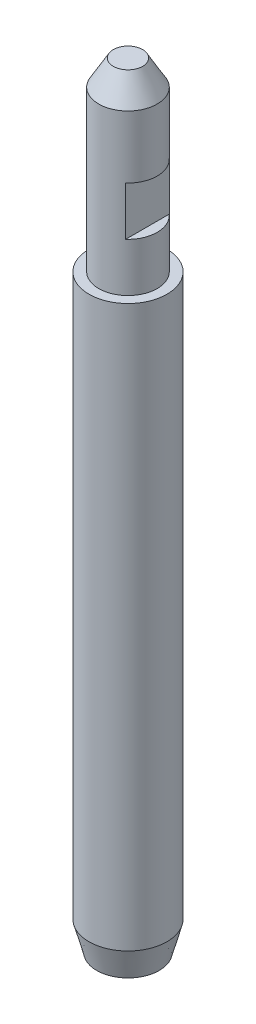
ISO-10303-21;
HEADER;
FILE_DESCRIPTION(('STEP AP214'),'2;1');
FILE_NAME('part.step','',(''),(''),'','','');
FILE_SCHEMA(('AUTOMOTIVE_DESIGN { 1 0 10303 214 1 1 1 1 }'));
ENDSEC;
DATA;
#1=APPLICATION_CONTEXT('core data for automotive mechanical design processes');
#2=APPLICATION_PROTOCOL_DEFINITION('international standard','automotive_design',2000,#1);
#3=PRODUCT_CONTEXT('',#1,'mechanical');
#4=PRODUCT('Part','Part','',(#3));
#5=PRODUCT_RELATED_PRODUCT_CATEGORY('part','',(#4));
#6=PRODUCT_DEFINITION_FORMATION('','',#4);
#7=PRODUCT_DEFINITION_CONTEXT('part definition',#1,'design');
#8=PRODUCT_DEFINITION('design','',#6,#7);
#9=PRODUCT_DEFINITION_SHAPE('','',#8);
#10=(LENGTH_UNIT() NAMED_UNIT(*) SI_UNIT(.MILLI.,.METRE.));
#11=(NAMED_UNIT(*) PLANE_ANGLE_UNIT() SI_UNIT($,.RADIAN.));
#12=(NAMED_UNIT(*) SI_UNIT($,.STERADIAN.) SOLID_ANGLE_UNIT());
#13=UNCERTAINTY_MEASURE_WITH_UNIT(LENGTH_MEASURE(1.E-05),#10,'distance_accuracy_value','');
#14=(GEOMETRIC_REPRESENTATION_CONTEXT(3) GLOBAL_UNCERTAINTY_ASSIGNED_CONTEXT((#13)) GLOBAL_UNIT_ASSIGNED_CONTEXT((#10,
#11,#12)) REPRESENTATION_CONTEXT('',''));
#15=CARTESIAN_POINT('',(0.,0.,0.));
#16=DIRECTION('',(0.,0.,1.));
#17=DIRECTION('',(1.,0.,0.));
#18=AXIS2_PLACEMENT_3D('',#15,#16,#17);
#19=CARTESIAN_POINT('',(-101.000000000001,30.,0.));
#20=DIRECTION('',(0.,-1.,0.));
#21=DIRECTION('',(0.,0.,-1.));
#22=AXIS2_PLACEMENT_3D('',#19,#20,#21);
#23=PLANE('',#22);
#24=CARTESIAN_POINT('',(-101.000000000001,30.,0.));
#25=DIRECTION('',(0.,-1.,0.));
#26=DIRECTION('',(0.,0.,-1.));
#27=AXIS2_PLACEMENT_3D('',#24,#25,#26);
#28=CIRCLE('',#27,1.60000000000001);
#29=CARTESIAN_POINT('',(-101.000000000001,30.,-1.59999999999998));
#30=VERTEX_POINT('',#29);
#31=EDGE_CURVE('E116',#30,#30,#28,.T.);
#32=ORIENTED_EDGE('',*,*,#31,.F.);
#33=EDGE_LOOP('',(#32));
#34=FACE_BOUND('',#33,.T.);
#35=CARTESIAN_POINT('',(-101.000000000001,30.,0.));
#36=DIRECTION('',(0.,1.,0.));
#37=DIRECTION('',(0.,0.,1.));
#38=AXIS2_PLACEMENT_3D('',#35,#36,#37);
#39=CIRCLE('',#38,3.20809032306486);
#40=CARTESIAN_POINT('',(-101.000000000001,30.,3.20809032306489));
#41=VERTEX_POINT('',#40);
#42=EDGE_CURVE('E95',#41,#41,#39,.T.);
#43=ORIENTED_EDGE('',*,*,#42,.F.);
#44=EDGE_LOOP('',(#43));
#45=FACE_BOUND('',#44,.T.);
#46=ADVANCED_FACE('F32',(#34,#45),#23,.T.);
#47=CARTESIAN_POINT('',(-101.000000000001,32.9554471493273,0.));
#48=DIRECTION('',(0.,1.,0.));
#49=DIRECTION('',(0.,0.,1.));
#50=AXIS2_PLACEMENT_3D('',#47,#48,#49);
#51=CONICAL_SURFACE('',#50,3.99999999999999,0.26179938779915);
#52=ORIENTED_EDGE('',*,*,#42,.T.);
#53=EDGE_LOOP('',(#52));
#54=FACE_BOUND('',#53,.T.);
#55=CARTESIAN_POINT('',(-101.000000000001,32.9554471493273,0.));
#56=DIRECTION('',(0.,1.,0.));
#57=DIRECTION('',(0.,0.,1.));
#58=AXIS2_PLACEMENT_3D('',#55,#56,#57);
#59=CIRCLE('',#58,3.99999999999999);
#60=CARTESIAN_POINT('',(-101.000000000001,32.9554471493273,4.00000000000007));
#61=VERTEX_POINT('',#60);
#62=EDGE_CURVE('E98',#61,#61,#59,.T.);
#63=ORIENTED_EDGE('',*,*,#62,.F.);
#64=EDGE_LOOP('',(#63));
#65=FACE_BOUND('',#64,.T.);
#66=ADVANCED_FACE('F136',(#54,#65),#51,.T.);
#67=CARTESIAN_POINT('',(-101.000000000001,106.972874386245,0.));
#68=DIRECTION('',(0.,1.,0.));
#69=DIRECTION('',(0.,0.,1.));
#70=AXIS2_PLACEMENT_3D('',#67,#68,#69);
#71=CYLINDRICAL_SURFACE('',#70,3.99999999999999);
#72=ORIENTED_EDGE('',*,*,#62,.T.);
#73=EDGE_LOOP('',(#72));
#74=FACE_BOUND('',#73,.T.);
#75=CARTESIAN_POINT('',(-101.000000000001,90.5,0.));
#76=DIRECTION('',(0.,1.,0.));
#77=DIRECTION('',(0.,0.,1.));
#78=AXIS2_PLACEMENT_3D('',#75,#76,#77);
#79=CIRCLE('',#78,3.99999999999999);
#80=CARTESIAN_POINT('',(-101.000000000001,90.5,4.00000000000005));
#81=VERTEX_POINT('',#80);
#82=EDGE_CURVE('E101',#81,#81,#79,.T.);
#83=ORIENTED_EDGE('',*,*,#82,.F.);
#84=EDGE_LOOP('',(#83));
#85=FACE_BOUND('',#84,.T.);
#86=ADVANCED_FACE('F141',(#74,#85),#71,.T.);
#87=CARTESIAN_POINT('',(-104.000000000001,90.5,0.));
#88=DIRECTION('',(0.,1.,0.));
#89=DIRECTION('',(0.,0.,1.));
#90=AXIS2_PLACEMENT_3D('',#87,#88,#89);
#91=PLANE('',#90);
#92=ORIENTED_EDGE('',*,*,#82,.T.);
#93=EDGE_LOOP('',(#92));
#94=FACE_BOUND('',#93,.T.);
#95=CARTESIAN_POINT('',(-101.000000000001,90.5,0.));
#96=DIRECTION('',(0.,1.,0.));
#97=DIRECTION('',(0.,0.,1.));
#98=AXIS2_PLACEMENT_3D('',#95,#96,#97);
#99=CIRCLE('',#98,3.);
#100=CARTESIAN_POINT('',(-101.000000000001,90.5,3.00000000000006));
#101=VERTEX_POINT('',#100);
#102=EDGE_CURVE('E104',#101,#101,#99,.T.);
#103=ORIENTED_EDGE('',*,*,#102,.F.);
#104=EDGE_LOOP('',(#103));
#105=FACE_BOUND('',#104,.T.);
#106=ADVANCED_FACE('F151',(#94,#105),#91,.T.);
#107=CARTESIAN_POINT('',(-101.000000000001,106.972874386245,0.));
#108=DIRECTION('',(0.,1.,0.));
#109=DIRECTION('',(0.,0.,1.));
#110=AXIS2_PLACEMENT_3D('',#107,#108,#109);
#111=CYLINDRICAL_SURFACE('',#110,3.);
#112=CARTESIAN_POINT('',(-101.000000000001,95.5,0.));
#113=DIRECTION('',(0.,-1.,0.));
#114=DIRECTION('',(0.,0.,-1.));
#115=AXIS2_PLACEMENT_3D('',#112,#113,#114);
#116=CIRCLE('',#115,3.);
#117=CARTESIAN_POINT('',(-99.0000000000008,95.5,2.23606797749984));
#118=VERTEX_POINT('',#117);
#119=CARTESIAN_POINT('',(-99.0000000000008,95.5,-2.23606797749976));
#120=VERTEX_POINT('',#119);
#121=EDGE_CURVE('E11',#118,#120,#116,.F.);
#122=ORIENTED_EDGE('',*,*,#121,.F.);
#123=DIRECTION('',(0.,1.,0.));
#124=VECTOR('',#123,1.);
#125=CARTESIAN_POINT('',(-99.0000000000008,106.972874386245,2.23606797749989));
#126=LINE('',#125,#124);
#127=CARTESIAN_POINT('',(-99.0000000000008,100.5,2.23606797749984));
#128=VERTEX_POINT('',#127);
#129=EDGE_CURVE('E39',#128,#118,#126,.F.);
#130=ORIENTED_EDGE('',*,*,#129,.F.);
#131=CARTESIAN_POINT('',(-101.000000000001,100.5,0.));
#132=DIRECTION('',(0.,1.,0.));
#133=DIRECTION('',(0.,0.,1.));
#134=AXIS2_PLACEMENT_3D('',#131,#132,#133);
#135=CIRCLE('',#134,3.);
#136=CARTESIAN_POINT('',(-99.0000000000007,100.5,-2.23606797749978));
#137=VERTEX_POINT('',#136);
#138=EDGE_CURVE('E69',#137,#128,#135,.F.);
#139=ORIENTED_EDGE('',*,*,#138,.F.);
#140=DIRECTION('',(0.,1.,0.));
#141=VECTOR('',#140,1.);
#142=CARTESIAN_POINT('',(-99.0000000000007,106.972874386245,-2.23606797749973));
#143=LINE('',#142,#141);
#144=EDGE_CURVE('E74',#120,#137,#143,.T.);
#145=ORIENTED_EDGE('',*,*,#144,.F.);
#146=EDGE_LOOP('',(#122,#130,#139,#145));
#147=FACE_BOUND('',#146,.T.);
#148=CARTESIAN_POINT('',(-101.000000000001,100.5,0.));
#149=DIRECTION('',(0.,1.,0.));
#150=DIRECTION('',(0.,0.,1.));
#151=AXIS2_PLACEMENT_3D('',#148,#149,#150);
#152=CIRCLE('',#151,3.);
#153=CARTESIAN_POINT('',(-103.000000000001,100.5,2.23606797749962));
#154=VERTEX_POINT('',#153);
#155=CARTESIAN_POINT('',(-103.000000000001,100.5,-2.23606797749978));
#156=VERTEX_POINT('',#155);
#157=EDGE_CURVE('E75',#154,#156,#152,.F.);
#158=ORIENTED_EDGE('',*,*,#157,.F.);
#159=DIRECTION('',(0.,1.,0.));
#160=VECTOR('',#159,1.);
#161=CARTESIAN_POINT('',(-103.000000000001,106.972874386245,2.23606797749973));
#162=LINE('',#161,#160);
#163=CARTESIAN_POINT('',(-103.000000000001,95.5,2.2360679774997));
#164=VERTEX_POINT('',#163);
#165=EDGE_CURVE('E91',#164,#154,#162,.T.);
#166=ORIENTED_EDGE('',*,*,#165,.F.);
#167=CARTESIAN_POINT('',(-101.000000000001,95.5,0.));
#168=DIRECTION('',(0.,-1.,0.));
#169=DIRECTION('',(0.,0.,-1.));
#170=AXIS2_PLACEMENT_3D('',#167,#168,#169);
#171=CIRCLE('',#170,3.);
#172=CARTESIAN_POINT('',(-103.000000000001,95.5,-2.23606797749976));
#173=VERTEX_POINT('',#172);
#174=EDGE_CURVE('E93',#173,#164,#171,.F.);
#175=ORIENTED_EDGE('',*,*,#174,.F.);
#176=DIRECTION('',(0.,1.,0.));
#177=VECTOR('',#176,1.);
#178=CARTESIAN_POINT('',(-103.000000000001,106.972874386245,-2.23606797749973));
#179=LINE('',#178,#177);
#180=EDGE_CURVE('E89',#156,#173,#179,.F.);
#181=ORIENTED_EDGE('',*,*,#180,.F.);
#182=EDGE_LOOP('',(#158,#166,#175,#181));
#183=FACE_BOUND('',#182,.T.);
#184=ORIENTED_EDGE('',*,*,#102,.T.);
#185=EDGE_LOOP('',(#184));
#186=FACE_BOUND('',#185,.T.);
#187=CARTESIAN_POINT('',(-101.000000000001,106.901923788647,0.));
#188=DIRECTION('',(0.,1.,0.));
#189=DIRECTION('',(0.,0.,1.));
#190=AXIS2_PLACEMENT_3D('',#187,#188,#189);
#191=CIRCLE('',#190,3.);
#192=CARTESIAN_POINT('',(-101.000000000001,106.901923788647,3.));
#193=VERTEX_POINT('',#192);
#194=EDGE_CURVE('E107',#193,#193,#191,.T.);
#195=ORIENTED_EDGE('',*,*,#194,.F.);
#196=EDGE_LOOP('',(#195));
#197=FACE_BOUND('',#196,.T.);
#198=ADVANCED_FACE('F84',(#147,#183,#186,#197),#111,.T.);
#199=CARTESIAN_POINT('',(-101.000000000001,109.5,0.));
#200=DIRECTION('',(0.,-1.,0.));
#201=DIRECTION('',(0.,0.,-1.));
#202=AXIS2_PLACEMENT_3D('',#199,#200,#201);
#203=CONICAL_SURFACE('',#202,1.5,0.523598775598304);
#204=ORIENTED_EDGE('',*,*,#194,.T.);
#205=EDGE_LOOP('',(#204));
#206=FACE_BOUND('',#205,.T.);
#207=CARTESIAN_POINT('',(-101.000000000001,109.5,0.));
#208=DIRECTION('',(0.,1.,0.));
#209=DIRECTION('',(0.,0.,1.));
#210=AXIS2_PLACEMENT_3D('',#207,#208,#209);
#211=CIRCLE('',#210,1.5);
#212=CARTESIAN_POINT('',(-101.000000000001,109.5,1.5));
#213=VERTEX_POINT('',#212);
#214=EDGE_CURVE('E110',#213,#213,#211,.T.);
#215=ORIENTED_EDGE('',*,*,#214,.F.);
#216=EDGE_LOOP('',(#215));
#217=FACE_BOUND('',#216,.T.);
#218=ADVANCED_FACE('F162',(#206,#217),#203,.T.);
#219=CARTESIAN_POINT('',(-102.500000000001,109.5,0.));
#220=DIRECTION('',(0.,1.,0.));
#221=DIRECTION('',(0.,0.,1.));
#222=AXIS2_PLACEMENT_3D('',#219,#220,#221);
#223=PLANE('',#222);
#224=ORIENTED_EDGE('',*,*,#214,.T.);
#225=EDGE_LOOP('',(#224));
#226=FACE_BOUND('',#225,.T.);
#227=ADVANCED_FACE('F168',(#226),#223,.T.);
#228=CARTESIAN_POINT('',(-101.000000000001,40.,0.));
#229=DIRECTION('',(0.,-1.,0.));
#230=DIRECTION('',(0.,0.,-1.));
#231=AXIS2_PLACEMENT_3D('',#228,#229,#230);
#232=CYLINDRICAL_SURFACE('',#231,1.60000000000001);
#233=CARTESIAN_POINT('',(-101.000000000001,40.,0.));
#234=DIRECTION('',(0.,-1.,0.));
#235=DIRECTION('',(0.,0.,-1.));
#236=AXIS2_PLACEMENT_3D('',#233,#234,#235);
#237=CIRCLE('',#236,1.60000000000001);
#238=CARTESIAN_POINT('',(-101.000000000001,40.,-1.59999999999995));
#239=VERTEX_POINT('',#238);
#240=EDGE_CURVE('E113',#239,#239,#237,.T.);
#241=ORIENTED_EDGE('',*,*,#240,.F.);
#242=EDGE_LOOP('',(#241));
#243=FACE_BOUND('',#242,.T.);
#244=ORIENTED_EDGE('',*,*,#31,.T.);
#245=EDGE_LOOP('',(#244));
#246=FACE_BOUND('',#245,.T.);
#247=ADVANCED_FACE('F173',(#243,#246),#232,.F.);
#248=CARTESIAN_POINT('',(-101.000000000001,40.,0.));
#249=DIRECTION('',(0.,-1.,0.));
#250=DIRECTION('',(0.,0.,-1.));
#251=AXIS2_PLACEMENT_3D('',#248,#249,#250);
#252=PLANE('',#251);
#253=ORIENTED_EDGE('',*,*,#240,.T.);
#254=EDGE_LOOP('',(#253));
#255=FACE_BOUND('',#254,.T.);
#256=ADVANCED_FACE('F178',(#255),#252,.T.);
#257=CARTESIAN_POINT('',(-104.955262845746,100.5,-5.49999999999998));
#258=DIRECTION('',(0.,1.,0.));
#259=DIRECTION('',(0.,0.,1.));
#260=AXIS2_PLACEMENT_3D('',#257,#258,#259);
#261=PLANE('',#260);
#262=ORIENTED_EDGE('',*,*,#157,.T.);
#263=DIRECTION('',(0.,0.,1.));
#264=VECTOR('',#263,1.);
#265=CARTESIAN_POINT('',(-103.000000000001,100.5,-5.49999999999989));
#266=LINE('',#265,#264);
#267=EDGE_CURVE('E119',#156,#154,#266,.T.);
#268=ORIENTED_EDGE('',*,*,#267,.T.);
#269=EDGE_LOOP('',(#262,#268));
#270=FACE_BOUND('',#269,.T.);
#271=ADVANCED_FACE('F183',(#270),#261,.F.);
#272=CARTESIAN_POINT('',(-103.000000000001,100.5,-5.49999999999989));
#273=DIRECTION('',(1.00000000000001,0.,0.));
#274=DIRECTION('',(0.,0.,-1.));
#275=AXIS2_PLACEMENT_3D('',#272,#273,#274);
#276=PLANE('',#275);
#277=ORIENTED_EDGE('',*,*,#180,.T.);
#278=DIRECTION('',(0.,0.,1.));
#279=VECTOR('',#278,1.);
#280=CARTESIAN_POINT('',(-103.000000000001,95.5,-5.49999999999987));
#281=LINE('',#280,#279);
#282=EDGE_CURVE('E52',#173,#164,#281,.T.);
#283=ORIENTED_EDGE('',*,*,#282,.T.);
#284=ORIENTED_EDGE('',*,*,#165,.T.);
#285=ORIENTED_EDGE('',*,*,#267,.F.);
#286=EDGE_LOOP('',(#277,#283,#284,#285));
#287=FACE_BOUND('',#286,.T.);
#288=ADVANCED_FACE('F133',(#287),#276,.F.);
#289=CARTESIAN_POINT('',(-104.955262845746,95.5,-5.49999999999998));
#290=DIRECTION('',(0.,-1.,0.));
#291=DIRECTION('',(0.,0.,-1.));
#292=AXIS2_PLACEMENT_3D('',#289,#290,#291);
#293=PLANE('',#292);
#294=ORIENTED_EDGE('',*,*,#174,.T.);
#295=ORIENTED_EDGE('',*,*,#282,.F.);
#296=EDGE_LOOP('',(#294,#295));
#297=FACE_BOUND('',#296,.T.);
#298=ADVANCED_FACE('F126',(#297),#293,.F.);
#299=CARTESIAN_POINT('',(-97.0447371542553,95.5,-5.50000000000012));
#300=DIRECTION('',(0.,-1.,0.));
#301=DIRECTION('',(0.,0.,-1.));
#302=AXIS2_PLACEMENT_3D('',#299,#300,#301);
#303=PLANE('',#302);
#304=ORIENTED_EDGE('',*,*,#121,.T.);
#305=DIRECTION('',(0.,0.,1.));
#306=VECTOR('',#305,1.);
#307=CARTESIAN_POINT('',(-99.0000000000007,95.5,-5.49999999999987));
#308=LINE('',#307,#306);
#309=EDGE_CURVE('E81',#120,#118,#308,.T.);
#310=ORIENTED_EDGE('',*,*,#309,.T.);
#311=EDGE_LOOP('',(#304,#310));
#312=FACE_BOUND('',#311,.T.);
#313=ADVANCED_FACE('F124',(#312),#303,.F.);
#314=CARTESIAN_POINT('',(-99.0000000000007,100.5,-5.49999999999989));
#315=DIRECTION('',(-1.00000000000001,0.,0.));
#316=DIRECTION('',(0.,0.,1.));
#317=AXIS2_PLACEMENT_3D('',#314,#315,#316);
#318=PLANE('',#317);
#319=ORIENTED_EDGE('',*,*,#129,.T.);
#320=ORIENTED_EDGE('',*,*,#309,.F.);
#321=ORIENTED_EDGE('',*,*,#144,.T.);
#322=DIRECTION('',(0.,0.,1.));
#323=VECTOR('',#322,1.);
#324=CARTESIAN_POINT('',(-99.0000000000007,100.5,-5.49999999999989));
#325=LINE('',#324,#323);
#326=EDGE_CURVE('E45',#137,#128,#325,.T.);
#327=ORIENTED_EDGE('',*,*,#326,.T.);
#328=EDGE_LOOP('',(#319,#320,#321,#327));
#329=FACE_BOUND('',#328,.T.);
#330=ADVANCED_FACE('F78',(#329),#318,.F.);
#331=CARTESIAN_POINT('',(-97.0447371542553,100.5,-5.50000000000006));
#332=DIRECTION('',(0.,1.,0.));
#333=DIRECTION('',(0.,0.,1.));
#334=AXIS2_PLACEMENT_3D('',#331,#332,#333);
#335=PLANE('',#334);
#336=ORIENTED_EDGE('',*,*,#138,.T.);
#337=ORIENTED_EDGE('',*,*,#326,.F.);
#338=EDGE_LOOP('',(#336,#337));
#339=FACE_BOUND('',#338,.T.);
#340=ADVANCED_FACE('F70',(#339),#335,.F.);
#341=CLOSED_SHELL('',(#46,#66,#86,#106,#198,#218,#227,#247,#256,#271,#288,#298,#313,#330,#340));
#342=MANIFOLD_SOLID_BREP('B2',#341);
#343=ADVANCED_BREP_SHAPE_REPRESENTATION('',(#18,#342),#14);
#344=SHAPE_DEFINITION_REPRESENTATION(#9,#343);
ENDSEC;
END-ISO-10303-21;
